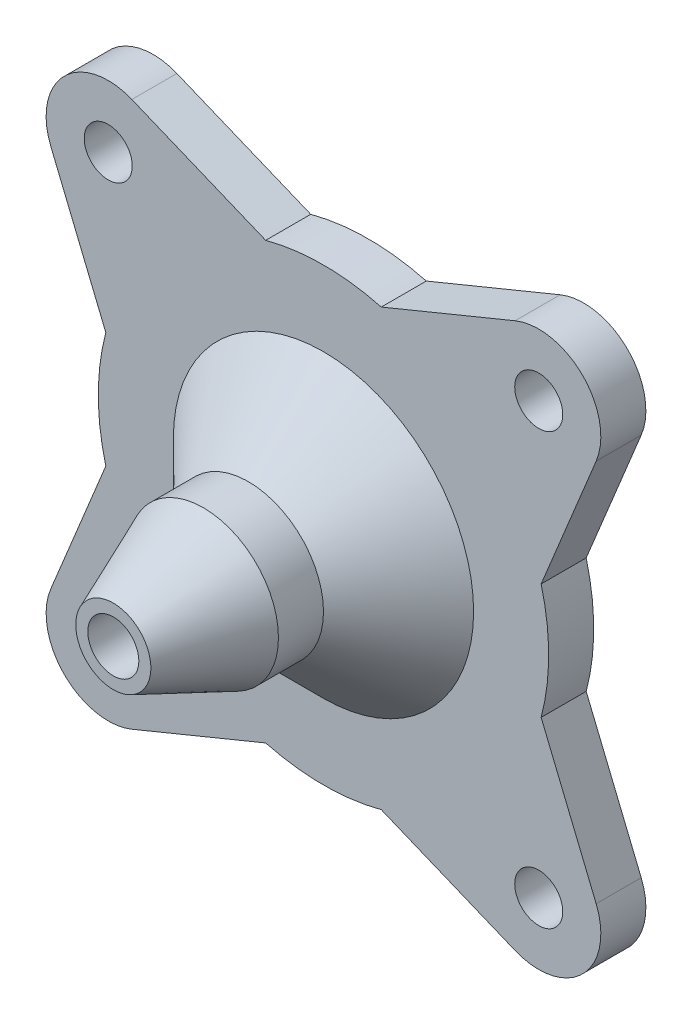
ISO-10303-21;
HEADER;
FILE_DESCRIPTION(('STEP AP214'),'2;1');
FILE_NAME('part.step','',(''),(''),'','','');
FILE_SCHEMA(('AUTOMOTIVE_DESIGN { 1 0 10303 214 1 1 1 1 }'));
ENDSEC;
DATA;
#1=APPLICATION_CONTEXT('core data for automotive mechanical design processes');
#2=APPLICATION_PROTOCOL_DEFINITION('international standard','automotive_design',2000,#1);
#3=PRODUCT_CONTEXT('',#1,'mechanical');
#4=PRODUCT('Part','Part','',(#3));
#5=PRODUCT_RELATED_PRODUCT_CATEGORY('part','',(#4));
#6=PRODUCT_DEFINITION_FORMATION('','',#4);
#7=PRODUCT_DEFINITION_CONTEXT('part definition',#1,'design');
#8=PRODUCT_DEFINITION('design','',#6,#7);
#9=PRODUCT_DEFINITION_SHAPE('','',#8);
#10=(LENGTH_UNIT() NAMED_UNIT(*) SI_UNIT(.MILLI.,.METRE.));
#11=(NAMED_UNIT(*) PLANE_ANGLE_UNIT() SI_UNIT($,.RADIAN.));
#12=(NAMED_UNIT(*) SI_UNIT($,.STERADIAN.) SOLID_ANGLE_UNIT());
#13=UNCERTAINTY_MEASURE_WITH_UNIT(LENGTH_MEASURE(1.E-05),#10,'distance_accuracy_value','');
#14=(GEOMETRIC_REPRESENTATION_CONTEXT(3) GLOBAL_UNCERTAINTY_ASSIGNED_CONTEXT((#13)) GLOBAL_UNIT_ASSIGNED_CONTEXT((#10,
#11,#12)) REPRESENTATION_CONTEXT('',''));
#15=CARTESIAN_POINT('',(0.,0.,0.));
#16=DIRECTION('',(0.,0.,1.));
#17=DIRECTION('',(1.,0.,0.));
#18=AXIS2_PLACEMENT_3D('',#15,#16,#17);
#19=CARTESIAN_POINT('',(0.,0.,3.));
#20=DIRECTION('',(0.,0.,-1.));
#21=DIRECTION('',(-1.,0.,0.));
#22=AXIS2_PLACEMENT_3D('',#19,#20,#21);
#23=CYLINDRICAL_SURFACE('',#22,15.);
#24=DIRECTION('',(0.,0.,-1.));
#25=VECTOR('',#24,1.);
#26=CARTESIAN_POINT('',(14.4977125126445,-3.84919886479132,3.));
#27=LINE('',#26,#25);
#28=CARTESIAN_POINT('',(14.4977125126445,-3.84919886479132,3.));
#29=VERTEX_POINT('',#28);
#30=CARTESIAN_POINT('',(14.4977125126445,-3.84919886479132,0.));
#31=VERTEX_POINT('',#30);
#32=EDGE_CURVE('E172',#29,#31,#27,.T.);
#33=ORIENTED_EDGE('',*,*,#32,.T.);
#34=CARTESIAN_POINT('',(0.,0.,0.));
#35=DIRECTION('',(0.,0.,1.));
#36=DIRECTION('',(1.,0.,0.));
#37=AXIS2_PLACEMENT_3D('',#34,#35,#36);
#38=CIRCLE('',#37,15.);
#39=CARTESIAN_POINT('',(14.4977125126445,3.84919886479131,0.));
#40=VERTEX_POINT('',#39);
#41=EDGE_CURVE('E345',#31,#40,#38,.T.);
#42=ORIENTED_EDGE('',*,*,#41,.T.);
#43=DIRECTION('',(0.,0.,-1.));
#44=VECTOR('',#43,1.);
#45=CARTESIAN_POINT('',(14.4977125126445,3.84919886479132,3.));
#46=LINE('',#45,#44);
#47=CARTESIAN_POINT('',(14.4977125126445,3.84919886479131,3.));
#48=VERTEX_POINT('',#47);
#49=EDGE_CURVE('E279',#48,#40,#46,.T.);
#50=ORIENTED_EDGE('',*,*,#49,.F.);
#51=CARTESIAN_POINT('',(0.,0.,3.));
#52=DIRECTION('',(0.,0.,1.));
#53=DIRECTION('',(1.,0.,0.));
#54=AXIS2_PLACEMENT_3D('',#51,#52,#53);
#55=CIRCLE('',#54,15.);
#56=EDGE_CURVE('E66',#29,#48,#55,.T.);
#57=ORIENTED_EDGE('',*,*,#56,.F.);
#58=EDGE_LOOP('',(#33,#42,#50,#57));
#59=FACE_BOUND('',#58,.T.);
#60=ADVANCED_FACE('F49',(#59),#23,.T.);
#61=DIRECTION('',(0.,0.,-1.));
#62=VECTOR('',#61,1.);
#63=CARTESIAN_POINT('',(3.84919886479127,-14.4977125126445,3.));
#64=LINE('',#63,#62);
#65=CARTESIAN_POINT('',(3.84919886479127,-14.4977125126445,3.));
#66=VERTEX_POINT('',#65);
#67=CARTESIAN_POINT('',(3.84919886479127,-14.4977125126445,0.));
#68=VERTEX_POINT('',#67);
#69=EDGE_CURVE('E74',#66,#68,#64,.T.);
#70=ORIENTED_EDGE('',*,*,#69,.F.);
#71=CARTESIAN_POINT('',(-3.84919886479127,-14.4977125126445,3.));
#72=VERTEX_POINT('',#71);
#73=EDGE_CURVE('E340',#72,#66,#55,.T.);
#74=ORIENTED_EDGE('',*,*,#73,.F.);
#75=DIRECTION('',(0.,0.,-1.));
#76=VECTOR('',#75,1.);
#77=CARTESIAN_POINT('',(-3.84919886479127,-14.4977125126445,3.));
#78=LINE('',#77,#76);
#79=CARTESIAN_POINT('',(-3.84919886479127,-14.4977125126445,0.));
#80=VERTEX_POINT('',#79);
#81=EDGE_CURVE('E237',#72,#80,#78,.T.);
#82=ORIENTED_EDGE('',*,*,#81,.T.);
#83=EDGE_CURVE('E344',#80,#68,#38,.T.);
#84=ORIENTED_EDGE('',*,*,#83,.T.);
#85=EDGE_LOOP('',(#70,#74,#82,#84));
#86=FACE_BOUND('',#85,.T.);
#87=ADVANCED_FACE('F371',(#86),#23,.T.);
#88=CARTESIAN_POINT('',(3.84919886479127,14.4977125126445,3.));
#89=VERTEX_POINT('',#88);
#90=CARTESIAN_POINT('',(-3.84919886479127,14.4977125126445,3.));
#91=VERTEX_POINT('',#90);
#92=EDGE_CURVE('E341',#89,#91,#55,.T.);
#93=ORIENTED_EDGE('',*,*,#92,.F.);
#94=DIRECTION('',(0.,0.,-1.));
#95=VECTOR('',#94,1.);
#96=CARTESIAN_POINT('',(3.84919886479127,14.4977125126445,3.));
#97=LINE('',#96,#95);
#98=CARTESIAN_POINT('',(3.84919886479127,14.4977125126445,0.));
#99=VERTEX_POINT('',#98);
#100=EDGE_CURVE('E283',#89,#99,#97,.T.);
#101=ORIENTED_EDGE('',*,*,#100,.T.);
#102=CARTESIAN_POINT('',(-3.84919886479127,14.4977125126445,0.));
#103=VERTEX_POINT('',#102);
#104=EDGE_CURVE('E336',#99,#103,#38,.T.);
#105=ORIENTED_EDGE('',*,*,#104,.T.);
#106=DIRECTION('',(0.,0.,-1.));
#107=VECTOR('',#106,1.);
#108=CARTESIAN_POINT('',(-3.84919886479127,14.4977125126445,3.));
#109=LINE('',#108,#107);
#110=EDGE_CURVE('E324',#91,#103,#109,.T.);
#111=ORIENTED_EDGE('',*,*,#110,.F.);
#112=EDGE_LOOP('',(#93,#101,#105,#111));
#113=FACE_BOUND('',#112,.T.);
#114=ADVANCED_FACE('F377',(#113),#23,.T.);
#115=CARTESIAN_POINT('',(-14.4977125126445,3.84919886479132,0.));
#116=VERTEX_POINT('',#115);
#117=CARTESIAN_POINT('',(-14.4977125126445,-3.84919886479131,0.));
#118=VERTEX_POINT('',#117);
#119=EDGE_CURVE('E342',#116,#118,#38,.T.);
#120=ORIENTED_EDGE('',*,*,#119,.T.);
#121=DIRECTION('',(0.,0.,-1.));
#122=VECTOR('',#121,1.);
#123=CARTESIAN_POINT('',(-14.4977125126445,-3.84919886479132,3.));
#124=LINE('',#123,#122);
#125=CARTESIAN_POINT('',(-14.4977125126445,-3.84919886479131,3.));
#126=VERTEX_POINT('',#125);
#127=EDGE_CURVE('E233',#126,#118,#124,.T.);
#128=ORIENTED_EDGE('',*,*,#127,.F.);
#129=CARTESIAN_POINT('',(-14.4977125126445,3.84919886479132,3.));
#130=VERTEX_POINT('',#129);
#131=EDGE_CURVE('E337',#130,#126,#55,.T.);
#132=ORIENTED_EDGE('',*,*,#131,.F.);
#133=DIRECTION('',(0.,0.,-1.));
#134=VECTOR('',#133,1.);
#135=CARTESIAN_POINT('',(-14.4977125126445,3.84919886479132,3.));
#136=LINE('',#135,#134);
#137=EDGE_CURVE('E328',#130,#116,#136,.T.);
#138=ORIENTED_EDGE('',*,*,#137,.T.);
#139=EDGE_LOOP('',(#120,#128,#132,#138));
#140=FACE_BOUND('',#139,.T.);
#141=ADVANCED_FACE('F372',(#140),#23,.T.);
#142=CARTESIAN_POINT('',(0.,0.,3.));
#143=DIRECTION('',(0.,0.,1.));
#144=DIRECTION('',(1.,0.,0.));
#145=AXIS2_PLACEMENT_3D('',#142,#143,#144);
#146=PLANE('',#145);
#147=CARTESIAN_POINT('',(0.,0.,3.));
#148=DIRECTION('',(0.,0.,1.));
#149=DIRECTION('',(1.,0.,0.));
#150=AXIS2_PLACEMENT_3D('',#147,#148,#149);
#151=CIRCLE('',#150,9.99999999999998);
#152=CARTESIAN_POINT('',(9.99999999999998,0.,3.));
#153=VERTEX_POINT('',#152);
#154=EDGE_CURVE('E11',#153,#153,#151,.F.);
#155=ORIENTED_EDGE('',*,*,#154,.T.);
#156=EDGE_LOOP('',(#155));
#157=FACE_BOUND('',#156,.T.);
#158=ORIENTED_EDGE('',*,*,#131,.T.);
#159=DIRECTION('',(0.380293736205366,0.92486576009871,0.));
#160=VECTOR('',#159,1.);
#161=CARTESIAN_POINT('',(-18.1635718085835,-12.7644857111743,3.));
#162=LINE('',#161,#160);
#163=CARTESIAN_POINT('',(-18.1635718085835,-12.7644857111743,3.));
#164=VERTEX_POINT('',#163);
#165=EDGE_CURVE('E216',#164,#126,#162,.T.);
#166=ORIENTED_EDGE('',*,*,#165,.F.);
#167=CARTESIAN_POINT('',(-14.337656369544,-14.3376563695441,3.));
#168=DIRECTION('',(0.,0.,-1.));
#169=DIRECTION('',(1.,0.,0.));
#170=AXIS2_PLACEMENT_3D('',#167,#168,#169);
#171=CIRCLE('',#170,4.13672513796073);
#172=CARTESIAN_POINT('',(-12.7644857111743,-18.1635718085836,3.));
#173=VERTEX_POINT('',#172);
#174=EDGE_CURVE('E207',#173,#164,#171,.T.);
#175=ORIENTED_EDGE('',*,*,#174,.F.);
#176=DIRECTION('',(-0.924865760098708,-0.380293736205368,0.));
#177=VECTOR('',#176,1.);
#178=CARTESIAN_POINT('',(-12.7644857111743,-18.1635718085836,3.));
#179=LINE('',#178,#177);
#180=EDGE_CURVE('E211',#72,#173,#179,.T.);
#181=ORIENTED_EDGE('',*,*,#180,.F.);
#182=ORIENTED_EDGE('',*,*,#73,.T.);
#183=DIRECTION('',(0.924865760098708,-0.380293736205368,0.));
#184=VECTOR('',#183,1.);
#185=CARTESIAN_POINT('',(12.7644857111743,-18.1635718085836,3.));
#186=LINE('',#185,#184);
#187=CARTESIAN_POINT('',(12.7644857111743,-18.1635718085836,3.));
#188=VERTEX_POINT('',#187);
#189=EDGE_CURVE('E175',#66,#188,#186,.T.);
#190=ORIENTED_EDGE('',*,*,#189,.T.);
#191=CARTESIAN_POINT('',(14.337656369544,-14.3376563695441,3.));
#192=DIRECTION('',(0.,0.,1.));
#193=DIRECTION('',(-1.,0.,0.));
#194=AXIS2_PLACEMENT_3D('',#191,#192,#193);
#195=CIRCLE('',#194,4.13672513796073);
#196=CARTESIAN_POINT('',(18.1635718085835,-12.7644857111743,3.));
#197=VERTEX_POINT('',#196);
#198=EDGE_CURVE('E176',#188,#197,#195,.T.);
#199=ORIENTED_EDGE('',*,*,#198,.T.);
#200=DIRECTION('',(-0.380293736205366,0.92486576009871,0.));
#201=VECTOR('',#200,1.);
#202=CARTESIAN_POINT('',(18.1635718085835,-12.7644857111743,3.));
#203=LINE('',#202,#201);
#204=EDGE_CURVE('E165',#197,#29,#203,.T.);
#205=ORIENTED_EDGE('',*,*,#204,.T.);
#206=ORIENTED_EDGE('',*,*,#56,.T.);
#207=DIRECTION('',(-0.380293736205366,-0.92486576009871,0.));
#208=VECTOR('',#207,1.);
#209=CARTESIAN_POINT('',(18.1635718085835,12.7644857111743,3.));
#210=LINE('',#209,#208);
#211=CARTESIAN_POINT('',(18.1635718085835,12.7644857111743,3.));
#212=VERTEX_POINT('',#211);
#213=EDGE_CURVE('E262',#212,#48,#210,.T.);
#214=ORIENTED_EDGE('',*,*,#213,.F.);
#215=CARTESIAN_POINT('',(14.337656369544,14.3376563695441,3.));
#216=DIRECTION('',(0.,0.,-1.));
#217=DIRECTION('',(-1.,0.,0.));
#218=AXIS2_PLACEMENT_3D('',#215,#216,#217);
#219=CIRCLE('',#218,4.13672513796073);
#220=CARTESIAN_POINT('',(12.7644857111743,18.1635718085836,3.));
#221=VERTEX_POINT('',#220);
#222=EDGE_CURVE('E253',#221,#212,#219,.T.);
#223=ORIENTED_EDGE('',*,*,#222,.F.);
#224=DIRECTION('',(0.924865760098708,0.380293736205368,0.));
#225=VECTOR('',#224,1.);
#226=CARTESIAN_POINT('',(12.7644857111743,18.1635718085836,3.));
#227=LINE('',#226,#225);
#228=EDGE_CURVE('E257',#89,#221,#227,.T.);
#229=ORIENTED_EDGE('',*,*,#228,.F.);
#230=ORIENTED_EDGE('',*,*,#92,.T.);
#231=DIRECTION('',(-0.924865760098708,0.380293736205368,0.));
#232=VECTOR('',#231,1.);
#233=CARTESIAN_POINT('',(-12.7644857111743,18.1635718085836,3.));
#234=LINE('',#233,#232);
#235=CARTESIAN_POINT('',(-12.7644857111743,18.1635718085836,3.));
#236=VERTEX_POINT('',#235);
#237=EDGE_CURVE('E308',#91,#236,#234,.T.);
#238=ORIENTED_EDGE('',*,*,#237,.T.);
#239=CARTESIAN_POINT('',(-14.337656369544,14.3376563695441,3.));
#240=DIRECTION('',(0.,0.,1.));
#241=DIRECTION('',(1.,0.,0.));
#242=AXIS2_PLACEMENT_3D('',#239,#240,#241);
#243=CIRCLE('',#242,4.13672513796073);
#244=CARTESIAN_POINT('',(-18.1635718085835,12.7644857111743,3.));
#245=VERTEX_POINT('',#244);
#246=EDGE_CURVE('E299',#236,#245,#243,.T.);
#247=ORIENTED_EDGE('',*,*,#246,.T.);
#248=DIRECTION('',(0.380293736205366,-0.92486576009871,0.));
#249=VECTOR('',#248,1.);
#250=CARTESIAN_POINT('',(-18.1635718085835,12.7644857111743,3.));
#251=LINE('',#250,#249);
#252=EDGE_CURVE('E303',#245,#130,#251,.T.);
#253=ORIENTED_EDGE('',*,*,#252,.T.);
#254=EDGE_LOOP('',(#158,#166,#175,#181,#182,#190,#199,#205,#206,#214,#223,#229,#230,#238,#247,#253));
#255=FACE_BOUND('',#254,.T.);
#256=CARTESIAN_POINT('',(-14.337656369544,14.3376563695441,3.));
#257=DIRECTION('',(0.,0.,1.));
#258=DIRECTION('',(1.,0.,0.));
#259=AXIS2_PLACEMENT_3D('',#256,#257,#258);
#260=CIRCLE('',#259,1.6);
#261=CARTESIAN_POINT('',(-12.737656369544,14.3376563695441,3.));
#262=VERTEX_POINT('',#261);
#263=EDGE_CURVE('E291',#262,#262,#260,.T.);
#264=ORIENTED_EDGE('',*,*,#263,.F.);
#265=EDGE_LOOP('',(#264));
#266=FACE_BOUND('',#265,.T.);
#267=CARTESIAN_POINT('',(14.337656369544,14.3376563695441,3.));
#268=DIRECTION('',(0.,0.,-1.));
#269=DIRECTION('',(-1.,0.,0.));
#270=AXIS2_PLACEMENT_3D('',#267,#268,#269);
#271=CIRCLE('',#270,1.6);
#272=CARTESIAN_POINT('',(12.737656369544,14.3376563695441,3.));
#273=VERTEX_POINT('',#272);
#274=EDGE_CURVE('E245',#273,#273,#271,.T.);
#275=ORIENTED_EDGE('',*,*,#274,.T.);
#276=EDGE_LOOP('',(#275));
#277=FACE_BOUND('',#276,.T.);
#278=CARTESIAN_POINT('',(-14.337656369544,-14.3376563695441,3.));
#279=DIRECTION('',(0.,0.,-1.));
#280=DIRECTION('',(1.,0.,0.));
#281=AXIS2_PLACEMENT_3D('',#278,#279,#280);
#282=CIRCLE('',#281,1.6);
#283=CARTESIAN_POINT('',(-12.737656369544,-14.3376563695441,3.));
#284=VERTEX_POINT('',#283);
#285=EDGE_CURVE('E198',#284,#284,#282,.T.);
#286=ORIENTED_EDGE('',*,*,#285,.T.);
#287=EDGE_LOOP('',(#286));
#288=FACE_BOUND('',#287,.T.);
#289=CARTESIAN_POINT('',(14.337656369544,-14.3376563695441,3.));
#290=DIRECTION('',(0.,0.,1.));
#291=DIRECTION('',(-1.,0.,0.));
#292=AXIS2_PLACEMENT_3D('',#289,#290,#291);
#293=CIRCLE('',#292,1.6);
#294=CARTESIAN_POINT('',(12.737656369544,-14.3376563695441,3.));
#295=VERTEX_POINT('',#294);
#296=EDGE_CURVE('E438',#295,#295,#293,.T.);
#297=ORIENTED_EDGE('',*,*,#296,.F.);
#298=EDGE_LOOP('',(#297));
#299=FACE_BOUND('',#298,.T.);
#300=ADVANCED_FACE('F180',(#157,#255,#266,#277,#288,#299),#146,.T.);
#301=CARTESIAN_POINT('',(0.,0.,0.));
#302=DIRECTION('',(0.,0.,1.));
#303=DIRECTION('',(1.,0.,0.));
#304=AXIS2_PLACEMENT_3D('',#301,#302,#303);
#305=PLANE('',#304);
#306=ORIENTED_EDGE('',*,*,#119,.F.);
#307=DIRECTION('',(0.380293736205366,-0.92486576009871,0.));
#308=VECTOR('',#307,1.);
#309=CARTESIAN_POINT('',(-18.1635718085835,12.7644857111743,0.));
#310=LINE('',#309,#308);
#311=CARTESIAN_POINT('',(-18.1635718085835,12.7644857111743,0.));
#312=VERTEX_POINT('',#311);
#313=EDGE_CURVE('E315',#312,#116,#310,.T.);
#314=ORIENTED_EDGE('',*,*,#313,.F.);
#315=CARTESIAN_POINT('',(-14.337656369544,14.3376563695441,0.));
#316=DIRECTION('',(0.,0.,1.));
#317=DIRECTION('',(1.,0.,0.));
#318=AXIS2_PLACEMENT_3D('',#315,#316,#317);
#319=CIRCLE('',#318,4.13672513796073);
#320=CARTESIAN_POINT('',(-12.7644857111743,18.1635718085836,0.));
#321=VERTEX_POINT('',#320);
#322=EDGE_CURVE('E295',#321,#312,#319,.T.);
#323=ORIENTED_EDGE('',*,*,#322,.F.);
#324=DIRECTION('',(-0.924865760098708,0.380293736205368,0.));
#325=VECTOR('',#324,1.);
#326=CARTESIAN_POINT('',(-12.7644857111743,18.1635718085836,0.));
#327=LINE('',#326,#325);
#328=EDGE_CURVE('E304',#103,#321,#327,.T.);
#329=ORIENTED_EDGE('',*,*,#328,.F.);
#330=ORIENTED_EDGE('',*,*,#104,.F.);
#331=DIRECTION('',(0.924865760098708,0.380293736205368,0.));
#332=VECTOR('',#331,1.);
#333=CARTESIAN_POINT('',(12.7644857111743,18.1635718085836,0.));
#334=LINE('',#333,#332);
#335=CARTESIAN_POINT('',(12.7644857111743,18.1635718085836,0.));
#336=VERTEX_POINT('',#335);
#337=EDGE_CURVE('E270',#99,#336,#334,.T.);
#338=ORIENTED_EDGE('',*,*,#337,.T.);
#339=CARTESIAN_POINT('',(14.337656369544,14.3376563695441,0.));
#340=DIRECTION('',(0.,0.,-1.));
#341=DIRECTION('',(-1.,0.,0.));
#342=AXIS2_PLACEMENT_3D('',#339,#340,#341);
#343=CIRCLE('',#342,4.13672513796073);
#344=CARTESIAN_POINT('',(18.1635718085835,12.7644857111743,0.));
#345=VERTEX_POINT('',#344);
#346=EDGE_CURVE('E249',#336,#345,#343,.T.);
#347=ORIENTED_EDGE('',*,*,#346,.T.);
#348=DIRECTION('',(-0.380293736205366,-0.92486576009871,0.));
#349=VECTOR('',#348,1.);
#350=CARTESIAN_POINT('',(18.1635718085835,12.7644857111743,0.));
#351=LINE('',#350,#349);
#352=EDGE_CURVE('E258',#345,#40,#351,.T.);
#353=ORIENTED_EDGE('',*,*,#352,.T.);
#354=ORIENTED_EDGE('',*,*,#41,.F.);
#355=DIRECTION('',(-0.380293736205366,0.92486576009871,0.));
#356=VECTOR('',#355,1.);
#357=CARTESIAN_POINT('',(18.1635718085835,-12.7644857111743,0.));
#358=LINE('',#357,#356);
#359=CARTESIAN_POINT('',(18.1635718085835,-12.7644857111743,0.));
#360=VERTEX_POINT('',#359);
#361=EDGE_CURVE('E428',#360,#31,#358,.T.);
#362=ORIENTED_EDGE('',*,*,#361,.F.);
#363=CARTESIAN_POINT('',(14.337656369544,-14.3376563695441,0.));
#364=DIRECTION('',(0.,0.,1.));
#365=DIRECTION('',(-1.,0.,0.));
#366=AXIS2_PLACEMENT_3D('',#363,#364,#365);
#367=CIRCLE('',#366,4.13672513796073);
#368=CARTESIAN_POINT('',(12.7644857111743,-18.1635718085836,0.));
#369=VERTEX_POINT('',#368);
#370=EDGE_CURVE('E191',#369,#360,#367,.T.);
#371=ORIENTED_EDGE('',*,*,#370,.F.);
#372=DIRECTION('',(0.924865760098708,-0.380293736205368,0.));
#373=VECTOR('',#372,1.);
#374=CARTESIAN_POINT('',(12.7644857111743,-18.1635718085836,0.));
#375=LINE('',#374,#373);
#376=EDGE_CURVE('E187',#68,#369,#375,.T.);
#377=ORIENTED_EDGE('',*,*,#376,.F.);
#378=ORIENTED_EDGE('',*,*,#83,.F.);
#379=DIRECTION('',(-0.924865760098708,-0.380293736205368,0.));
#380=VECTOR('',#379,1.);
#381=CARTESIAN_POINT('',(-12.7644857111743,-18.1635718085836,0.));
#382=LINE('',#381,#380);
#383=CARTESIAN_POINT('',(-12.7644857111743,-18.1635718085836,0.));
#384=VERTEX_POINT('',#383);
#385=EDGE_CURVE('E224',#80,#384,#382,.T.);
#386=ORIENTED_EDGE('',*,*,#385,.T.);
#387=CARTESIAN_POINT('',(-14.337656369544,-14.3376563695441,0.));
#388=DIRECTION('',(0.,0.,-1.));
#389=DIRECTION('',(1.,0.,0.));
#390=AXIS2_PLACEMENT_3D('',#387,#388,#389);
#391=CIRCLE('',#390,4.13672513796073);
#392=CARTESIAN_POINT('',(-18.1635718085835,-12.7644857111743,0.));
#393=VERTEX_POINT('',#392);
#394=EDGE_CURVE('E205',#384,#393,#391,.T.);
#395=ORIENTED_EDGE('',*,*,#394,.T.);
#396=DIRECTION('',(0.380293736205366,0.92486576009871,0.));
#397=VECTOR('',#396,1.);
#398=CARTESIAN_POINT('',(-18.1635718085835,-12.7644857111743,0.));
#399=LINE('',#398,#397);
#400=EDGE_CURVE('E212',#393,#118,#399,.T.);
#401=ORIENTED_EDGE('',*,*,#400,.T.);
#402=EDGE_LOOP('',(#306,#314,#323,#329,#330,#338,#347,#353,#354,#362,#371,#377,#378,#386,#395,#401));
#403=FACE_BOUND('',#402,.T.);
#404=CARTESIAN_POINT('',(-14.337656369544,14.3376563695441,0.));
#405=DIRECTION('',(0.,0.,1.));
#406=DIRECTION('',(1.,0.,0.));
#407=AXIS2_PLACEMENT_3D('',#404,#405,#406);
#408=CIRCLE('',#407,1.6);
#409=CARTESIAN_POINT('',(-12.737656369544,14.3376563695441,0.));
#410=VERTEX_POINT('',#409);
#411=EDGE_CURVE('E290',#410,#410,#408,.T.);
#412=ORIENTED_EDGE('',*,*,#411,.T.);
#413=EDGE_LOOP('',(#412));
#414=FACE_BOUND('',#413,.T.);
#415=CARTESIAN_POINT('',(14.337656369544,14.3376563695441,0.));
#416=DIRECTION('',(0.,0.,-1.));
#417=DIRECTION('',(-1.,0.,0.));
#418=AXIS2_PLACEMENT_3D('',#415,#416,#417);
#419=CIRCLE('',#418,1.6);
#420=CARTESIAN_POINT('',(12.737656369544,14.3376563695441,0.));
#421=VERTEX_POINT('',#420);
#422=EDGE_CURVE('E244',#421,#421,#419,.T.);
#423=ORIENTED_EDGE('',*,*,#422,.F.);
#424=EDGE_LOOP('',(#423));
#425=FACE_BOUND('',#424,.T.);
#426=CARTESIAN_POINT('',(-14.337656369544,-14.3376563695441,0.));
#427=DIRECTION('',(0.,0.,-1.));
#428=DIRECTION('',(1.,0.,0.));
#429=AXIS2_PLACEMENT_3D('',#426,#427,#428);
#430=CIRCLE('',#429,1.6);
#431=CARTESIAN_POINT('',(-12.737656369544,-14.3376563695441,0.));
#432=VERTEX_POINT('',#431);
#433=EDGE_CURVE('E193',#432,#432,#430,.T.);
#434=ORIENTED_EDGE('',*,*,#433,.F.);
#435=EDGE_LOOP('',(#434));
#436=FACE_BOUND('',#435,.T.);
#437=CARTESIAN_POINT('',(14.337656369544,-14.3376563695441,0.));
#438=DIRECTION('',(0.,0.,1.));
#439=DIRECTION('',(-1.,0.,0.));
#440=AXIS2_PLACEMENT_3D('',#437,#438,#439);
#441=CIRCLE('',#440,1.6);
#442=CARTESIAN_POINT('',(12.737656369544,-14.3376563695441,0.));
#443=VERTEX_POINT('',#442);
#444=EDGE_CURVE('E441',#443,#443,#441,.T.);
#445=ORIENTED_EDGE('',*,*,#444,.T.);
#446=EDGE_LOOP('',(#445));
#447=FACE_BOUND('',#446,.T.);
#448=ADVANCED_FACE('F385',(#403,#414,#425,#436,#447),#305,.F.);
#449=CARTESIAN_POINT('',(-14.337656369544,14.3376563695441,3.));
#450=DIRECTION('',(0.,0.,-1.));
#451=DIRECTION('',(-1.,0.,0.));
#452=AXIS2_PLACEMENT_3D('',#449,#450,#451);
#453=CYLINDRICAL_SURFACE('',#452,4.13672513796073);
#454=ORIENTED_EDGE('',*,*,#322,.T.);
#455=DIRECTION('',(0.,0.,-1.));
#456=VECTOR('',#455,1.);
#457=CARTESIAN_POINT('',(-18.1635718085835,12.7644857111743,3.));
#458=LINE('',#457,#456);
#459=EDGE_CURVE('E332',#245,#312,#458,.T.);
#460=ORIENTED_EDGE('',*,*,#459,.F.);
#461=ORIENTED_EDGE('',*,*,#246,.F.);
#462=DIRECTION('',(0.,0.,-1.));
#463=VECTOR('',#462,1.);
#464=CARTESIAN_POINT('',(-12.7644857111743,18.1635718085836,3.));
#465=LINE('',#464,#463);
#466=EDGE_CURVE('E311',#236,#321,#465,.T.);
#467=ORIENTED_EDGE('',*,*,#466,.T.);
#468=EDGE_LOOP('',(#454,#460,#461,#467));
#469=FACE_BOUND('',#468,.T.);
#470=ADVANCED_FACE('F410',(#469),#453,.T.);
#471=CARTESIAN_POINT('',(-18.1635718085835,12.7644857111743,3.));
#472=DIRECTION('',(0.924865760098709,0.380293736205366,0.));
#473=DIRECTION('',(-0.380293736205366,0.92486576009871,0.));
#474=AXIS2_PLACEMENT_3D('',#471,#472,#473);
#475=PLANE('',#474);
#476=ORIENTED_EDGE('',*,*,#313,.T.);
#477=ORIENTED_EDGE('',*,*,#137,.F.);
#478=ORIENTED_EDGE('',*,*,#252,.F.);
#479=ORIENTED_EDGE('',*,*,#459,.T.);
#480=EDGE_LOOP('',(#476,#477,#478,#479));
#481=FACE_BOUND('',#480,.T.);
#482=ADVANCED_FACE('F406',(#481),#475,.F.);
#483=CARTESIAN_POINT('',(-12.7644857111743,18.1635718085836,3.));
#484=DIRECTION('',(-0.380293736205368,-0.924865760098708,0.));
#485=DIRECTION('',(0.924865760098709,-0.380293736205368,0.));
#486=AXIS2_PLACEMENT_3D('',#483,#484,#485);
#487=PLANE('',#486);
#488=ORIENTED_EDGE('',*,*,#328,.T.);
#489=ORIENTED_EDGE('',*,*,#466,.F.);
#490=ORIENTED_EDGE('',*,*,#237,.F.);
#491=ORIENTED_EDGE('',*,*,#110,.T.);
#492=EDGE_LOOP('',(#488,#489,#490,#491));
#493=FACE_BOUND('',#492,.T.);
#494=ADVANCED_FACE('F414',(#493),#487,.F.);
#495=CARTESIAN_POINT('',(-14.337656369544,14.3376563695441,3.));
#496=DIRECTION('',(0.,0.,-1.));
#497=DIRECTION('',(-1.,0.,0.));
#498=AXIS2_PLACEMENT_3D('',#495,#496,#497);
#499=CYLINDRICAL_SURFACE('',#498,1.6);
#500=ORIENTED_EDGE('',*,*,#263,.T.);
#501=EDGE_LOOP('',(#500));
#502=FACE_BOUND('',#501,.T.);
#503=ORIENTED_EDGE('',*,*,#411,.F.);
#504=EDGE_LOOP('',(#503));
#505=FACE_BOUND('',#504,.T.);
#506=ADVANCED_FACE('F513',(#502,#505),#499,.F.);
#507=CARTESIAN_POINT('',(14.337656369544,14.3376563695441,3.));
#508=DIRECTION('',(0.,0.,-1.));
#509=DIRECTION('',(-1.,0.,0.));
#510=AXIS2_PLACEMENT_3D('',#507,#508,#509);
#511=CYLINDRICAL_SURFACE('',#510,4.13672513796073);
#512=ORIENTED_EDGE('',*,*,#346,.F.);
#513=DIRECTION('',(0.,0.,-1.));
#514=VECTOR('',#513,1.);
#515=CARTESIAN_POINT('',(12.7644857111743,18.1635718085836,3.));
#516=LINE('',#515,#514);
#517=EDGE_CURVE('E287',#221,#336,#516,.T.);
#518=ORIENTED_EDGE('',*,*,#517,.F.);
#519=ORIENTED_EDGE('',*,*,#222,.T.);
#520=DIRECTION('',(0.,0.,-1.));
#521=VECTOR('',#520,1.);
#522=CARTESIAN_POINT('',(18.1635718085835,12.7644857111743,3.));
#523=LINE('',#522,#521);
#524=EDGE_CURVE('E266',#212,#345,#523,.T.);
#525=ORIENTED_EDGE('',*,*,#524,.T.);
#526=EDGE_LOOP('',(#512,#518,#519,#525));
#527=FACE_BOUND('',#526,.T.);
#528=ADVANCED_FACE('F509',(#527),#511,.T.);
#529=CARTESIAN_POINT('',(12.7644857111743,18.1635718085836,3.));
#530=DIRECTION('',(-0.380293736205368,0.924865760098708,0.));
#531=DIRECTION('',(-0.924865760098709,-0.380293736205368,0.));
#532=AXIS2_PLACEMENT_3D('',#529,#530,#531);
#533=PLANE('',#532);
#534=ORIENTED_EDGE('',*,*,#337,.F.);
#535=ORIENTED_EDGE('',*,*,#100,.F.);
#536=ORIENTED_EDGE('',*,*,#228,.T.);
#537=ORIENTED_EDGE('',*,*,#517,.T.);
#538=EDGE_LOOP('',(#534,#535,#536,#537));
#539=FACE_BOUND('',#538,.T.);
#540=ADVANCED_FACE('F505',(#539),#533,.T.);
#541=CARTESIAN_POINT('',(18.1635718085835,12.7644857111743,3.));
#542=DIRECTION('',(0.924865760098709,-0.380293736205366,0.));
#543=DIRECTION('',(0.380293736205366,0.92486576009871,0.));
#544=AXIS2_PLACEMENT_3D('',#541,#542,#543);
#545=PLANE('',#544);
#546=ORIENTED_EDGE('',*,*,#352,.F.);
#547=ORIENTED_EDGE('',*,*,#524,.F.);
#548=ORIENTED_EDGE('',*,*,#213,.T.);
#549=ORIENTED_EDGE('',*,*,#49,.T.);
#550=EDGE_LOOP('',(#546,#547,#548,#549));
#551=FACE_BOUND('',#550,.T.);
#552=ADVANCED_FACE('F501',(#551),#545,.T.);
#553=CARTESIAN_POINT('',(14.337656369544,14.3376563695441,3.));
#554=DIRECTION('',(0.,0.,-1.));
#555=DIRECTION('',(-1.,0.,0.));
#556=AXIS2_PLACEMENT_3D('',#553,#554,#555);
#557=CYLINDRICAL_SURFACE('',#556,1.6);
#558=ORIENTED_EDGE('',*,*,#274,.F.);
#559=EDGE_LOOP('',(#558));
#560=FACE_BOUND('',#559,.T.);
#561=ORIENTED_EDGE('',*,*,#422,.T.);
#562=EDGE_LOOP('',(#561));
#563=FACE_BOUND('',#562,.T.);
#564=ADVANCED_FACE('F499',(#560,#563),#557,.F.);
#565=CARTESIAN_POINT('',(-14.337656369544,-14.3376563695441,3.));
#566=DIRECTION('',(0.,0.,-1.));
#567=DIRECTION('',(-1.,0.,0.));
#568=AXIS2_PLACEMENT_3D('',#565,#566,#567);
#569=CYLINDRICAL_SURFACE('',#568,4.13672513796073);
#570=ORIENTED_EDGE('',*,*,#394,.F.);
#571=DIRECTION('',(0.,0.,-1.));
#572=VECTOR('',#571,1.);
#573=CARTESIAN_POINT('',(-12.7644857111743,-18.1635718085836,3.));
#574=LINE('',#573,#572);
#575=EDGE_CURVE('E241',#173,#384,#574,.T.);
#576=ORIENTED_EDGE('',*,*,#575,.F.);
#577=ORIENTED_EDGE('',*,*,#174,.T.);
#578=DIRECTION('',(0.,0.,-1.));
#579=VECTOR('',#578,1.);
#580=CARTESIAN_POINT('',(-18.1635718085835,-12.7644857111743,3.));
#581=LINE('',#580,#579);
#582=EDGE_CURVE('E220',#164,#393,#581,.T.);
#583=ORIENTED_EDGE('',*,*,#582,.T.);
#584=EDGE_LOOP('',(#570,#576,#577,#583));
#585=FACE_BOUND('',#584,.T.);
#586=ADVANCED_FACE('F400',(#585),#569,.T.);
#587=CARTESIAN_POINT('',(-12.7644857111743,-18.1635718085836,3.));
#588=DIRECTION('',(0.380293736205368,-0.924865760098708,0.));
#589=DIRECTION('',(0.924865760098709,0.380293736205368,0.));
#590=AXIS2_PLACEMENT_3D('',#587,#588,#589);
#591=PLANE('',#590);
#592=ORIENTED_EDGE('',*,*,#385,.F.);
#593=ORIENTED_EDGE('',*,*,#81,.F.);
#594=ORIENTED_EDGE('',*,*,#180,.T.);
#595=ORIENTED_EDGE('',*,*,#575,.T.);
#596=EDGE_LOOP('',(#592,#593,#594,#595));
#597=FACE_BOUND('',#596,.T.);
#598=ADVANCED_FACE('F493',(#597),#591,.T.);
#599=CARTESIAN_POINT('',(-18.1635718085835,-12.7644857111743,3.));
#600=DIRECTION('',(-0.924865760098709,0.380293736205366,0.));
#601=DIRECTION('',(-0.380293736205366,-0.92486576009871,0.));
#602=AXIS2_PLACEMENT_3D('',#599,#600,#601);
#603=PLANE('',#602);
#604=ORIENTED_EDGE('',*,*,#400,.F.);
#605=ORIENTED_EDGE('',*,*,#582,.F.);
#606=ORIENTED_EDGE('',*,*,#165,.T.);
#607=ORIENTED_EDGE('',*,*,#127,.T.);
#608=EDGE_LOOP('',(#604,#605,#606,#607));
#609=FACE_BOUND('',#608,.T.);
#610=ADVANCED_FACE('F394',(#609),#603,.T.);
#611=CARTESIAN_POINT('',(-14.337656369544,-14.3376563695441,3.));
#612=DIRECTION('',(0.,0.,-1.));
#613=DIRECTION('',(-1.,0.,0.));
#614=AXIS2_PLACEMENT_3D('',#611,#612,#613);
#615=CYLINDRICAL_SURFACE('',#614,1.6);
#616=ORIENTED_EDGE('',*,*,#285,.F.);
#617=EDGE_LOOP('',(#616));
#618=FACE_BOUND('',#617,.T.);
#619=ORIENTED_EDGE('',*,*,#433,.T.);
#620=EDGE_LOOP('',(#619));
#621=FACE_BOUND('',#620,.T.);
#622=ADVANCED_FACE('F487',(#618,#621),#615,.F.);
#623=CARTESIAN_POINT('',(14.337656369544,-14.3376563695441,3.));
#624=DIRECTION('',(0.,0.,-1.));
#625=DIRECTION('',(-1.,0.,0.));
#626=AXIS2_PLACEMENT_3D('',#623,#624,#625);
#627=CYLINDRICAL_SURFACE('',#626,4.13672513796073);
#628=ORIENTED_EDGE('',*,*,#370,.T.);
#629=DIRECTION('',(0.,0.,-1.));
#630=VECTOR('',#629,1.);
#631=CARTESIAN_POINT('',(18.1635718085835,-12.7644857111743,3.));
#632=LINE('',#631,#630);
#633=EDGE_CURVE('E170',#197,#360,#632,.T.);
#634=ORIENTED_EDGE('',*,*,#633,.F.);
#635=ORIENTED_EDGE('',*,*,#198,.F.);
#636=DIRECTION('',(0.,0.,-1.));
#637=VECTOR('',#636,1.);
#638=CARTESIAN_POINT('',(12.7644857111743,-18.1635718085836,3.));
#639=LINE('',#638,#637);
#640=EDGE_CURVE('E426',#188,#369,#639,.T.);
#641=ORIENTED_EDGE('',*,*,#640,.T.);
#642=EDGE_LOOP('',(#628,#634,#635,#641));
#643=FACE_BOUND('',#642,.T.);
#644=ADVANCED_FACE('F189',(#643),#627,.T.);
#645=CARTESIAN_POINT('',(18.1635718085835,-12.7644857111743,3.));
#646=DIRECTION('',(-0.924865760098709,-0.380293736205366,0.));
#647=DIRECTION('',(0.380293736205366,-0.92486576009871,0.));
#648=AXIS2_PLACEMENT_3D('',#645,#646,#647);
#649=PLANE('',#648);
#650=ORIENTED_EDGE('',*,*,#361,.T.);
#651=ORIENTED_EDGE('',*,*,#32,.F.);
#652=ORIENTED_EDGE('',*,*,#204,.F.);
#653=ORIENTED_EDGE('',*,*,#633,.T.);
#654=EDGE_LOOP('',(#650,#651,#652,#653));
#655=FACE_BOUND('',#654,.T.);
#656=ADVANCED_FACE('F168',(#655),#649,.F.);
#657=CARTESIAN_POINT('',(12.7644857111743,-18.1635718085836,3.));
#658=DIRECTION('',(0.380293736205368,0.924865760098708,0.));
#659=DIRECTION('',(-0.924865760098709,0.380293736205368,0.));
#660=AXIS2_PLACEMENT_3D('',#657,#658,#659);
#661=PLANE('',#660);
#662=ORIENTED_EDGE('',*,*,#376,.T.);
#663=ORIENTED_EDGE('',*,*,#640,.F.);
#664=ORIENTED_EDGE('',*,*,#189,.F.);
#665=ORIENTED_EDGE('',*,*,#69,.T.);
#666=EDGE_LOOP('',(#662,#663,#664,#665));
#667=FACE_BOUND('',#666,.T.);
#668=ADVANCED_FACE('F424',(#667),#661,.F.);
#669=CARTESIAN_POINT('',(14.337656369544,-14.3376563695441,3.));
#670=DIRECTION('',(0.,0.,-1.));
#671=DIRECTION('',(-1.,0.,0.));
#672=AXIS2_PLACEMENT_3D('',#669,#670,#671);
#673=CYLINDRICAL_SURFACE('',#672,1.6);
#674=ORIENTED_EDGE('',*,*,#296,.T.);
#675=EDGE_LOOP('',(#674));
#676=FACE_BOUND('',#675,.T.);
#677=ORIENTED_EDGE('',*,*,#444,.F.);
#678=EDGE_LOOP('',(#677));
#679=FACE_BOUND('',#678,.T.);
#680=ADVANCED_FACE('F474',(#676,#679),#673,.F.);
#681=CARTESIAN_POINT('',(0.,0.,11.));
#682=DIRECTION('',(0.,0.,-1.));
#683=DIRECTION('',(-1.,0.,0.));
#684=AXIS2_PLACEMENT_3D('',#681,#682,#683);
#685=CYLINDRICAL_SURFACE('',#684,5.);
#686=CARTESIAN_POINT('',(0.,0.,8.00000000000003));
#687=DIRECTION('',(0.,0.,1.));
#688=DIRECTION('',(1.,0.,0.));
#689=AXIS2_PLACEMENT_3D('',#686,#687,#688);
#690=CIRCLE('',#689,5.);
#691=CARTESIAN_POINT('',(5.,0.,8.00000000000003));
#692=VERTEX_POINT('',#691);
#693=EDGE_CURVE('E59',#692,#692,#690,.T.);
#694=ORIENTED_EDGE('',*,*,#693,.T.);
#695=EDGE_LOOP('',(#694));
#696=FACE_BOUND('',#695,.T.);
#697=CARTESIAN_POINT('',(0.,0.,11.));
#698=DIRECTION('',(0.,0.,1.));
#699=DIRECTION('',(1.,0.,0.));
#700=AXIS2_PLACEMENT_3D('',#697,#698,#699);
#701=CIRCLE('',#700,5.);
#702=CARTESIAN_POINT('',(5.,0.,11.));
#703=VERTEX_POINT('',#702);
#704=EDGE_CURVE('E447',#703,#703,#701,.T.);
#705=ORIENTED_EDGE('',*,*,#704,.F.);
#706=EDGE_LOOP('',(#705));
#707=FACE_BOUND('',#706,.T.);
#708=ADVANCED_FACE('F350',(#696,#707),#685,.T.);
#709=CARTESIAN_POINT('',(0.,0.,17.));
#710=DIRECTION('',(0.,0.,1.));
#711=DIRECTION('',(1.,0.,0.));
#712=AXIS2_PLACEMENT_3D('',#709,#710,#711);
#713=PLANE('',#712);
#714=CARTESIAN_POINT('',(0.,0.,17.));
#715=DIRECTION('',(0.,0.,1.));
#716=DIRECTION('',(1.,0.,0.));
#717=AXIS2_PLACEMENT_3D('',#714,#715,#716);
#718=CIRCLE('',#717,1.7);
#719=CARTESIAN_POINT('',(1.7,0.,17.));
#720=VERTEX_POINT('',#719);
#721=EDGE_CURVE('E458',#720,#720,#718,.T.);
#722=ORIENTED_EDGE('',*,*,#721,.F.);
#723=EDGE_LOOP('',(#722));
#724=FACE_BOUND('',#723,.T.);
#725=CARTESIAN_POINT('',(0.,0.,17.));
#726=DIRECTION('',(0.,0.,-1.));
#727=DIRECTION('',(-1.,0.,0.));
#728=AXIS2_PLACEMENT_3D('',#725,#726,#727);
#729=CIRCLE('',#728,2.5);
#730=CARTESIAN_POINT('',(-2.5,0.,17.));
#731=VERTEX_POINT('',#730);
#732=EDGE_CURVE('E453',#731,#731,#729,.T.);
#733=ORIENTED_EDGE('',*,*,#732,.F.);
#734=EDGE_LOOP('',(#733));
#735=FACE_BOUND('',#734,.T.);
#736=ADVANCED_FACE('F366',(#724,#735),#713,.T.);
#737=CARTESIAN_POINT('',(0.,0.,11.));
#738=DIRECTION('',(0.,0.,-1.));
#739=DIRECTION('',(-1.,0.,0.));
#740=AXIS2_PLACEMENT_3D('',#737,#738,#739);
#741=CONICAL_SURFACE('',#740,5.,0.394791119699761);
#742=ORIENTED_EDGE('',*,*,#732,.T.);
#743=EDGE_LOOP('',(#742));
#744=FACE_BOUND('',#743,.T.);
#745=ORIENTED_EDGE('',*,*,#704,.T.);
#746=EDGE_LOOP('',(#745));
#747=FACE_BOUND('',#746,.T.);
#748=ADVANCED_FACE('F355',(#744,#747),#741,.T.);
#749=CARTESIAN_POINT('',(0.,0.,8.00000000000003));
#750=DIRECTION('',(0.,0.,-1.));
#751=DIRECTION('',(-1.,0.,0.));
#752=AXIS2_PLACEMENT_3D('',#749,#750,#751);
#753=CONICAL_SURFACE('',#752,5.,0.785398163397443);
#754=ORIENTED_EDGE('',*,*,#154,.F.);
#755=EDGE_LOOP('',(#754));
#756=FACE_BOUND('',#755,.T.);
#757=ORIENTED_EDGE('',*,*,#693,.F.);
#758=EDGE_LOOP('',(#757));
#759=FACE_BOUND('',#758,.T.);
#760=ADVANCED_FACE('F52',(#756,#759),#753,.T.);
#761=CARTESIAN_POINT('',(0.,0.,5.));
#762=DIRECTION('',(0.,0.,1.));
#763=DIRECTION('',(1.,0.,0.));
#764=AXIS2_PLACEMENT_3D('',#761,#762,#763);
#765=CYLINDRICAL_SURFACE('',#764,1.7);
#766=CARTESIAN_POINT('',(0.,0.,5.));
#767=DIRECTION('',(0.,0.,1.));
#768=DIRECTION('',(1.,0.,0.));
#769=AXIS2_PLACEMENT_3D('',#766,#767,#768);
#770=CIRCLE('',#769,1.7);
#771=CARTESIAN_POINT('',(1.7,0.,5.));
#772=VERTEX_POINT('',#771);
#773=EDGE_CURVE('E457',#772,#772,#770,.T.);
#774=ORIENTED_EDGE('',*,*,#773,.F.);
#775=EDGE_LOOP('',(#774));
#776=FACE_BOUND('',#775,.T.);
#777=ORIENTED_EDGE('',*,*,#721,.T.);
#778=EDGE_LOOP('',(#777));
#779=FACE_BOUND('',#778,.T.);
#780=ADVANCED_FACE('F354',(#776,#779),#765,.F.);
#781=CARTESIAN_POINT('',(0.,0.,5.));
#782=DIRECTION('',(0.,0.,1.));
#783=DIRECTION('',(1.,0.,0.));
#784=AXIS2_PLACEMENT_3D('',#781,#782,#783);
#785=PLANE('',#784);
#786=ORIENTED_EDGE('',*,*,#773,.T.);
#787=EDGE_LOOP('',(#786));
#788=FACE_BOUND('',#787,.T.);
#789=ADVANCED_FACE('F362',(#788),#785,.T.);
#790=CLOSED_SHELL('',(#60,#87,#114,#141,#300,#448,#470,#482,#494,#506,#528,#540,#552,#564,#586,
#598,#610,#622,#644,#656,#668,#680,#708,#736,#748,#760,#780,#789));
#791=MANIFOLD_SOLID_BREP('B2',#790);
#792=ADVANCED_BREP_SHAPE_REPRESENTATION('',(#18,#791),#14);
#793=SHAPE_DEFINITION_REPRESENTATION(#9,#792);
ENDSEC;
END-ISO-10303-21;
